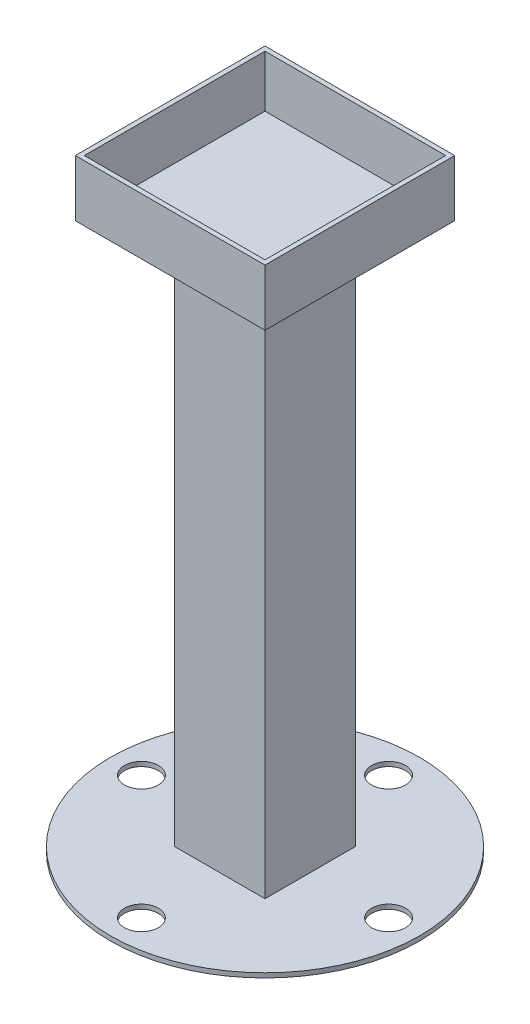
ISO-10303-21;
HEADER;
FILE_DESCRIPTION(('STEP AP214'),'2;1');
FILE_NAME('part.step','',(''),(''),'','','');
FILE_SCHEMA(('AUTOMOTIVE_DESIGN { 1 0 10303 214 1 1 1 1 }'));
ENDSEC;
DATA;
#1=APPLICATION_CONTEXT('core data for automotive mechanical design processes');
#2=APPLICATION_PROTOCOL_DEFINITION('international standard','automotive_design',2000,#1);
#3=PRODUCT_CONTEXT('',#1,'mechanical');
#4=PRODUCT('Part','Part','',(#3));
#5=PRODUCT_RELATED_PRODUCT_CATEGORY('part','',(#4));
#6=PRODUCT_DEFINITION_FORMATION('','',#4);
#7=PRODUCT_DEFINITION_CONTEXT('part definition',#1,'design');
#8=PRODUCT_DEFINITION('design','',#6,#7);
#9=PRODUCT_DEFINITION_SHAPE('','',#8);
#10=(LENGTH_UNIT() NAMED_UNIT(*) SI_UNIT(.MILLI.,.METRE.));
#11=(NAMED_UNIT(*) PLANE_ANGLE_UNIT() SI_UNIT($,.RADIAN.));
#12=(NAMED_UNIT(*) SI_UNIT($,.STERADIAN.) SOLID_ANGLE_UNIT());
#13=UNCERTAINTY_MEASURE_WITH_UNIT(LENGTH_MEASURE(1.E-05),#10,'distance_accuracy_value','');
#14=(GEOMETRIC_REPRESENTATION_CONTEXT(3) GLOBAL_UNCERTAINTY_ASSIGNED_CONTEXT((#13)) GLOBAL_UNIT_ASSIGNED_CONTEXT((#10,
#11,#12)) REPRESENTATION_CONTEXT('',''));
#15=CARTESIAN_POINT('',(0.,0.,0.));
#16=DIRECTION('',(0.,0.,1.));
#17=DIRECTION('',(1.,0.,0.));
#18=AXIS2_PLACEMENT_3D('',#15,#16,#17);
#19=CARTESIAN_POINT('',(0.,2.54,0.));
#20=DIRECTION('',(0.,-1.,0.));
#21=DIRECTION('',(0.,0.,-1.));
#22=AXIS2_PLACEMENT_3D('',#19,#20,#21);
#23=CYLINDRICAL_SURFACE('',#22,86.9315);
#24=CARTESIAN_POINT('',(0.,2.54,0.));
#25=DIRECTION('',(0.,1.,0.));
#26=DIRECTION('',(0.,0.,1.));
#27=AXIS2_PLACEMENT_3D('',#24,#25,#26);
#28=CIRCLE('',#27,86.9315);
#29=CARTESIAN_POINT('',(0.,2.54,86.9315));
#30=VERTEX_POINT('',#29);
#31=EDGE_CURVE('E11',#30,#30,#28,.T.);
#32=ORIENTED_EDGE('',*,*,#31,.F.);
#33=EDGE_LOOP('',(#32));
#34=FACE_BOUND('',#33,.T.);
#35=CARTESIAN_POINT('',(0.,0.,0.));
#36=DIRECTION('',(0.,1.,0.));
#37=DIRECTION('',(0.,0.,1.));
#38=AXIS2_PLACEMENT_3D('',#35,#36,#37);
#39=CIRCLE('',#38,86.9315);
#40=CARTESIAN_POINT('',(0.,0.,86.9315));
#41=VERTEX_POINT('',#40);
#42=EDGE_CURVE('E54',#41,#41,#39,.T.);
#43=ORIENTED_EDGE('',*,*,#42,.T.);
#44=EDGE_LOOP('',(#43));
#45=FACE_BOUND('',#44,.T.);
#46=ADVANCED_FACE('F45',(#34,#45),#23,.T.);
#47=CARTESIAN_POINT('',(0.,2.54,0.));
#48=DIRECTION('',(0.,1.,0.));
#49=DIRECTION('',(0.,0.,1.));
#50=AXIS2_PLACEMENT_3D('',#47,#48,#49);
#51=PLANE('',#50);
#52=CARTESIAN_POINT('',(0.,2.54,-69.50075));
#53=DIRECTION('',(0.,1.,0.));
#54=DIRECTION('',(0.,0.,1.));
#55=AXIS2_PLACEMENT_3D('',#52,#53,#54);
#56=CIRCLE('',#55,9.525);
#57=CARTESIAN_POINT('',(0.,2.54,-59.97575));
#58=VERTEX_POINT('',#57);
#59=EDGE_CURVE('E284',#58,#58,#56,.T.);
#60=ORIENTED_EDGE('',*,*,#59,.F.);
#61=EDGE_LOOP('',(#60));
#62=FACE_BOUND('',#61,.T.);
#63=CARTESIAN_POINT('',(69.50075,2.54,0.));
#64=DIRECTION('',(0.,1.,0.));
#65=DIRECTION('',(0.,0.,1.));
#66=AXIS2_PLACEMENT_3D('',#63,#64,#65);
#67=CIRCLE('',#66,9.52500000000002);
#68=CARTESIAN_POINT('',(69.50075,2.54,9.52500000000002));
#69=VERTEX_POINT('',#68);
#70=EDGE_CURVE('E399',#69,#69,#67,.T.);
#71=ORIENTED_EDGE('',*,*,#70,.F.);
#72=EDGE_LOOP('',(#71));
#73=FACE_BOUND('',#72,.T.);
#74=CARTESIAN_POINT('',(0.,2.54,69.50075));
#75=DIRECTION('',(0.,1.,0.));
#76=DIRECTION('',(0.,0.,1.));
#77=AXIS2_PLACEMENT_3D('',#74,#75,#76);
#78=CIRCLE('',#77,9.52499999999999);
#79=CARTESIAN_POINT('',(0.,2.54,79.02575));
#80=VERTEX_POINT('',#79);
#81=EDGE_CURVE('E391',#80,#80,#78,.T.);
#82=ORIENTED_EDGE('',*,*,#81,.F.);
#83=EDGE_LOOP('',(#82));
#84=FACE_BOUND('',#83,.T.);
#85=CARTESIAN_POINT('',(-69.50075,2.54,0.));
#86=DIRECTION('',(0.,1.,0.));
#87=DIRECTION('',(0.,0.,1.));
#88=AXIS2_PLACEMENT_3D('',#85,#86,#87);
#89=CIRCLE('',#88,9.52500000000001);
#90=CARTESIAN_POINT('',(-69.50075,2.54,9.52500000000001));
#91=VERTEX_POINT('',#90);
#92=EDGE_CURVE('E166',#91,#91,#89,.T.);
#93=ORIENTED_EDGE('',*,*,#92,.F.);
#94=EDGE_LOOP('',(#93));
#95=FACE_BOUND('',#94,.T.);
#96=DIRECTION('',(0.,0.,-1.));
#97=VECTOR('',#96,1.);
#98=CARTESIAN_POINT('',(25.4,2.54,-25.4));
#99=LINE('',#98,#97);
#100=CARTESIAN_POINT('',(25.4,2.54,25.4));
#101=VERTEX_POINT('',#100);
#102=CARTESIAN_POINT('',(25.4,2.54,-25.4));
#103=VERTEX_POINT('',#102);
#104=EDGE_CURVE('E70',#101,#103,#99,.T.);
#105=ORIENTED_EDGE('',*,*,#104,.F.);
#106=DIRECTION('',(1.,0.,0.));
#107=VECTOR('',#106,1.);
#108=CARTESIAN_POINT('',(-25.4,2.54,25.4));
#109=LINE('',#108,#107);
#110=CARTESIAN_POINT('',(-25.4,2.54,25.4));
#111=VERTEX_POINT('',#110);
#112=EDGE_CURVE('E236',#111,#101,#109,.T.);
#113=ORIENTED_EDGE('',*,*,#112,.F.);
#114=DIRECTION('',(0.,0.,1.));
#115=VECTOR('',#114,1.);
#116=CARTESIAN_POINT('',(-25.4,2.54,-25.4));
#117=LINE('',#116,#115);
#118=CARTESIAN_POINT('',(-25.4,2.54,-25.4));
#119=VERTEX_POINT('',#118);
#120=EDGE_CURVE('E255',#119,#111,#117,.T.);
#121=ORIENTED_EDGE('',*,*,#120,.F.);
#122=DIRECTION('',(-1.,0.,0.));
#123=VECTOR('',#122,1.);
#124=CARTESIAN_POINT('',(-25.4,2.54,-25.4));
#125=LINE('',#124,#123);
#126=EDGE_CURVE('E251',#103,#119,#125,.T.);
#127=ORIENTED_EDGE('',*,*,#126,.F.);
#128=EDGE_LOOP('',(#105,#113,#121,#127));
#129=FACE_BOUND('',#128,.T.);
#130=ORIENTED_EDGE('',*,*,#31,.T.);
#131=EDGE_LOOP('',(#130));
#132=FACE_BOUND('',#131,.T.);
#133=ADVANCED_FACE('F311',(#62,#73,#84,#95,#129,#132),#51,.T.);
#134=CARTESIAN_POINT('',(0.,0.,0.));
#135=DIRECTION('',(0.,1.,0.));
#136=DIRECTION('',(0.,0.,1.));
#137=AXIS2_PLACEMENT_3D('',#134,#135,#136);
#138=PLANE('',#137);
#139=CARTESIAN_POINT('',(0.,0.,-69.50075));
#140=DIRECTION('',(0.,1.,0.));
#141=DIRECTION('',(0.,0.,1.));
#142=AXIS2_PLACEMENT_3D('',#139,#140,#141);
#143=CIRCLE('',#142,9.525);
#144=CARTESIAN_POINT('',(0.,0.,-59.97575));
#145=VERTEX_POINT('',#144);
#146=EDGE_CURVE('E48',#145,#145,#143,.T.);
#147=ORIENTED_EDGE('',*,*,#146,.T.);
#148=EDGE_LOOP('',(#147));
#149=FACE_BOUND('',#148,.T.);
#150=CARTESIAN_POINT('',(69.50075,0.,0.));
#151=DIRECTION('',(0.,1.,0.));
#152=DIRECTION('',(0.,0.,1.));
#153=AXIS2_PLACEMENT_3D('',#150,#151,#152);
#154=CIRCLE('',#153,9.52500000000002);
#155=CARTESIAN_POINT('',(69.50075,0.,9.52500000000002));
#156=VERTEX_POINT('',#155);
#157=EDGE_CURVE('E287',#156,#156,#154,.T.);
#158=ORIENTED_EDGE('',*,*,#157,.T.);
#159=EDGE_LOOP('',(#158));
#160=FACE_BOUND('',#159,.T.);
#161=CARTESIAN_POINT('',(0.,0.,69.50075));
#162=DIRECTION('',(0.,1.,0.));
#163=DIRECTION('',(0.,0.,1.));
#164=AXIS2_PLACEMENT_3D('',#161,#162,#163);
#165=CIRCLE('',#164,9.52499999999999);
#166=CARTESIAN_POINT('',(0.,0.,79.02575));
#167=VERTEX_POINT('',#166);
#168=EDGE_CURVE('E283',#167,#167,#165,.T.);
#169=ORIENTED_EDGE('',*,*,#168,.T.);
#170=EDGE_LOOP('',(#169));
#171=FACE_BOUND('',#170,.T.);
#172=CARTESIAN_POINT('',(-69.50075,0.,0.));
#173=DIRECTION('',(0.,1.,0.));
#174=DIRECTION('',(0.,0.,1.));
#175=AXIS2_PLACEMENT_3D('',#172,#173,#174);
#176=CIRCLE('',#175,9.52500000000001);
#177=CARTESIAN_POINT('',(-69.50075,0.,9.52500000000001));
#178=VERTEX_POINT('',#177);
#179=EDGE_CURVE('E279',#178,#178,#176,.T.);
#180=ORIENTED_EDGE('',*,*,#179,.T.);
#181=EDGE_LOOP('',(#180));
#182=FACE_BOUND('',#181,.T.);
#183=ORIENTED_EDGE('',*,*,#42,.F.);
#184=EDGE_LOOP('',(#183));
#185=FACE_BOUND('',#184,.T.);
#186=ADVANCED_FACE('F296',(#149,#160,#171,#182,#185),#138,.F.);
#187=CARTESIAN_POINT('',(25.4,307.34,-25.4));
#188=DIRECTION('',(-1.,0.,0.));
#189=DIRECTION('',(0.,0.,1.));
#190=AXIS2_PLACEMENT_3D('',#187,#188,#189);
#191=PLANE('',#190);
#192=ORIENTED_EDGE('',*,*,#104,.T.);
#193=DIRECTION('',(0.,-1.,0.));
#194=VECTOR('',#193,1.);
#195=CARTESIAN_POINT('',(25.4,307.34,-25.4));
#196=LINE('',#195,#194);
#197=CARTESIAN_POINT('',(25.4,307.34,-25.4));
#198=VERTEX_POINT('',#197);
#199=EDGE_CURVE('E272',#198,#103,#196,.T.);
#200=ORIENTED_EDGE('',*,*,#199,.F.);
#201=DIRECTION('',(0.,0.,-1.));
#202=VECTOR('',#201,1.);
#203=CARTESIAN_POINT('',(25.4,307.34,-25.4));
#204=LINE('',#203,#202);
#205=CARTESIAN_POINT('',(25.4,307.34,25.4));
#206=VERTEX_POINT('',#205);
#207=EDGE_CURVE('E231',#206,#198,#204,.T.);
#208=ORIENTED_EDGE('',*,*,#207,.F.);
#209=DIRECTION('',(0.,-1.,0.));
#210=VECTOR('',#209,1.);
#211=CARTESIAN_POINT('',(25.4,307.34,25.4));
#212=LINE('',#211,#210);
#213=EDGE_CURVE('E248',#206,#101,#212,.T.);
#214=ORIENTED_EDGE('',*,*,#213,.T.);
#215=EDGE_LOOP('',(#192,#200,#208,#214));
#216=FACE_BOUND('',#215,.T.);
#217=ADVANCED_FACE('F324',(#216),#191,.F.);
#218=CARTESIAN_POINT('',(-25.4,307.34,-25.4));
#219=DIRECTION('',(0.,0.,1.));
#220=DIRECTION('',(1.,0.,0.));
#221=AXIS2_PLACEMENT_3D('',#218,#219,#220);
#222=PLANE('',#221);
#223=ORIENTED_EDGE('',*,*,#126,.T.);
#224=DIRECTION('',(0.,-1.,0.));
#225=VECTOR('',#224,1.);
#226=CARTESIAN_POINT('',(-25.4,307.34,-25.4));
#227=LINE('',#226,#225);
#228=CARTESIAN_POINT('',(-25.4,307.34,-25.4));
#229=VERTEX_POINT('',#228);
#230=EDGE_CURVE('E268',#229,#119,#227,.T.);
#231=ORIENTED_EDGE('',*,*,#230,.F.);
#232=DIRECTION('',(-1.,0.,0.));
#233=VECTOR('',#232,1.);
#234=CARTESIAN_POINT('',(-25.4,307.34,-25.4));
#235=LINE('',#234,#233);
#236=EDGE_CURVE('E235',#198,#229,#235,.T.);
#237=ORIENTED_EDGE('',*,*,#236,.F.);
#238=ORIENTED_EDGE('',*,*,#199,.T.);
#239=EDGE_LOOP('',(#223,#231,#237,#238));
#240=FACE_BOUND('',#239,.T.);
#241=ADVANCED_FACE('F328',(#240),#222,.F.);
#242=CARTESIAN_POINT('',(-25.4,307.34,-25.4));
#243=DIRECTION('',(1.,0.,0.));
#244=DIRECTION('',(0.,0.,-1.));
#245=AXIS2_PLACEMENT_3D('',#242,#243,#244);
#246=PLANE('',#245);
#247=ORIENTED_EDGE('',*,*,#120,.T.);
#248=DIRECTION('',(0.,-1.,0.));
#249=VECTOR('',#248,1.);
#250=CARTESIAN_POINT('',(-25.4,307.34,25.4));
#251=LINE('',#250,#249);
#252=CARTESIAN_POINT('',(-25.4,307.34,25.4));
#253=VERTEX_POINT('',#252);
#254=EDGE_CURVE('E264',#253,#111,#251,.T.);
#255=ORIENTED_EDGE('',*,*,#254,.F.);
#256=DIRECTION('',(0.,0.,1.));
#257=VECTOR('',#256,1.);
#258=CARTESIAN_POINT('',(-25.4,307.34,-25.4));
#259=LINE('',#258,#257);
#260=EDGE_CURVE('E240',#229,#253,#259,.T.);
#261=ORIENTED_EDGE('',*,*,#260,.F.);
#262=ORIENTED_EDGE('',*,*,#230,.T.);
#263=EDGE_LOOP('',(#247,#255,#261,#262));
#264=FACE_BOUND('',#263,.T.);
#265=ADVANCED_FACE('F334',(#264),#246,.F.);
#266=CARTESIAN_POINT('',(-25.4,307.34,25.4));
#267=DIRECTION('',(0.,0.,-1.));
#268=DIRECTION('',(-1.,0.,0.));
#269=AXIS2_PLACEMENT_3D('',#266,#267,#268);
#270=PLANE('',#269);
#271=ORIENTED_EDGE('',*,*,#112,.T.);
#272=ORIENTED_EDGE('',*,*,#213,.F.);
#273=DIRECTION('',(1.,0.,0.));
#274=VECTOR('',#273,1.);
#275=CARTESIAN_POINT('',(-25.4,307.34,25.4));
#276=LINE('',#275,#274);
#277=EDGE_CURVE('E244',#253,#206,#276,.T.);
#278=ORIENTED_EDGE('',*,*,#277,.F.);
#279=ORIENTED_EDGE('',*,*,#254,.T.);
#280=EDGE_LOOP('',(#271,#272,#278,#279));
#281=FACE_BOUND('',#280,.T.);
#282=ADVANCED_FACE('F338',(#281),#270,.F.);
#283=CARTESIAN_POINT('',(-53.34,339.09,-53.34));
#284=DIRECTION('',(0.,0.,1.));
#285=DIRECTION('',(1.,0.,0.));
#286=AXIS2_PLACEMENT_3D('',#283,#284,#285);
#287=PLANE('',#286);
#288=DIRECTION('',(-1.,0.,0.));
#289=VECTOR('',#288,1.);
#290=CARTESIAN_POINT('',(-53.34,307.34,-53.34));
#291=LINE('',#290,#289);
#292=CARTESIAN_POINT('',(53.34,307.34,-53.34));
#293=VERTEX_POINT('',#292);
#294=CARTESIAN_POINT('',(-53.34,307.34,-53.34));
#295=VERTEX_POINT('',#294);
#296=EDGE_CURVE('E184',#293,#295,#291,.T.);
#297=ORIENTED_EDGE('',*,*,#296,.T.);
#298=DIRECTION('',(0.,-1.,0.));
#299=VECTOR('',#298,1.);
#300=CARTESIAN_POINT('',(-53.34,339.09,-53.34));
#301=LINE('',#300,#299);
#302=CARTESIAN_POINT('',(-53.34,339.09,-53.34));
#303=VERTEX_POINT('',#302);
#304=EDGE_CURVE('E227',#303,#295,#301,.T.);
#305=ORIENTED_EDGE('',*,*,#304,.F.);
#306=DIRECTION('',(-1.,0.,0.));
#307=VECTOR('',#306,1.);
#308=CARTESIAN_POINT('',(-53.34,339.09,-53.34));
#309=LINE('',#308,#307);
#310=CARTESIAN_POINT('',(53.34,339.09,-53.34));
#311=VERTEX_POINT('',#310);
#312=EDGE_CURVE('E190',#311,#303,#309,.T.);
#313=ORIENTED_EDGE('',*,*,#312,.F.);
#314=DIRECTION('',(0.,-1.,0.));
#315=VECTOR('',#314,1.);
#316=CARTESIAN_POINT('',(53.34,339.09,-53.34));
#317=LINE('',#316,#315);
#318=EDGE_CURVE('E204',#311,#293,#317,.T.);
#319=ORIENTED_EDGE('',*,*,#318,.T.);
#320=EDGE_LOOP('',(#297,#305,#313,#319));
#321=FACE_BOUND('',#320,.T.);
#322=ADVANCED_FACE('F342',(#321),#287,.F.);
#323=CARTESIAN_POINT('',(-53.34,339.09,-53.34));
#324=DIRECTION('',(1.,0.,0.));
#325=DIRECTION('',(0.,0.,-1.));
#326=AXIS2_PLACEMENT_3D('',#323,#324,#325);
#327=PLANE('',#326);
#328=DIRECTION('',(0.,0.,1.));
#329=VECTOR('',#328,1.);
#330=CARTESIAN_POINT('',(-53.34,307.34,-53.34));
#331=LINE('',#330,#329);
#332=CARTESIAN_POINT('',(-53.34,307.34,53.34));
#333=VERTEX_POINT('',#332);
#334=EDGE_CURVE('E208',#295,#333,#331,.T.);
#335=ORIENTED_EDGE('',*,*,#334,.T.);
#336=DIRECTION('',(0.,-1.,0.));
#337=VECTOR('',#336,1.);
#338=CARTESIAN_POINT('',(-53.34,339.09,53.34));
#339=LINE('',#338,#337);
#340=CARTESIAN_POINT('',(-53.34,339.09,53.34));
#341=VERTEX_POINT('',#340);
#342=EDGE_CURVE('E223',#341,#333,#339,.T.);
#343=ORIENTED_EDGE('',*,*,#342,.F.);
#344=DIRECTION('',(0.,0.,1.));
#345=VECTOR('',#344,1.);
#346=CARTESIAN_POINT('',(-53.34,339.09,-53.34));
#347=LINE('',#346,#345);
#348=EDGE_CURVE('E194',#303,#341,#347,.T.);
#349=ORIENTED_EDGE('',*,*,#348,.F.);
#350=ORIENTED_EDGE('',*,*,#304,.T.);
#351=EDGE_LOOP('',(#335,#343,#349,#350));
#352=FACE_BOUND('',#351,.T.);
#353=ADVANCED_FACE('F346',(#352),#327,.F.);
#354=CARTESIAN_POINT('',(-53.34,339.09,53.34));
#355=DIRECTION('',(0.,0.,-1.));
#356=DIRECTION('',(-1.,0.,0.));
#357=AXIS2_PLACEMENT_3D('',#354,#355,#356);
#358=PLANE('',#357);
#359=DIRECTION('',(1.,0.,0.));
#360=VECTOR('',#359,1.);
#361=CARTESIAN_POINT('',(-53.34,307.34,53.34));
#362=LINE('',#361,#360);
#363=CARTESIAN_POINT('',(53.34,307.34,53.34));
#364=VERTEX_POINT('',#363);
#365=EDGE_CURVE('E211',#333,#364,#362,.T.);
#366=ORIENTED_EDGE('',*,*,#365,.T.);
#367=DIRECTION('',(0.,-1.,0.));
#368=VECTOR('',#367,1.);
#369=CARTESIAN_POINT('',(53.34,339.09,53.34));
#370=LINE('',#369,#368);
#371=CARTESIAN_POINT('',(53.34,339.09,53.34));
#372=VERTEX_POINT('',#371);
#373=EDGE_CURVE('E219',#372,#364,#370,.T.);
#374=ORIENTED_EDGE('',*,*,#373,.F.);
#375=DIRECTION('',(1.,0.,0.));
#376=VECTOR('',#375,1.);
#377=CARTESIAN_POINT('',(-53.34,339.09,53.34));
#378=LINE('',#377,#376);
#379=EDGE_CURVE('E198',#341,#372,#378,.T.);
#380=ORIENTED_EDGE('',*,*,#379,.F.);
#381=ORIENTED_EDGE('',*,*,#342,.T.);
#382=EDGE_LOOP('',(#366,#374,#380,#381));
#383=FACE_BOUND('',#382,.T.);
#384=ADVANCED_FACE('F350',(#383),#358,.F.);
#385=CARTESIAN_POINT('',(53.34,339.09,-53.34));
#386=DIRECTION('',(-1.,0.,0.));
#387=DIRECTION('',(0.,0.,1.));
#388=AXIS2_PLACEMENT_3D('',#385,#386,#387);
#389=PLANE('',#388);
#390=DIRECTION('',(0.,0.,-1.));
#391=VECTOR('',#390,1.);
#392=CARTESIAN_POINT('',(53.34,307.34,-53.34));
#393=LINE('',#392,#391);
#394=EDGE_CURVE('E195',#364,#293,#393,.T.);
#395=ORIENTED_EDGE('',*,*,#394,.T.);
#396=ORIENTED_EDGE('',*,*,#318,.F.);
#397=DIRECTION('',(0.,0.,-1.));
#398=VECTOR('',#397,1.);
#399=CARTESIAN_POINT('',(53.34,339.09,-53.34));
#400=LINE('',#399,#398);
#401=EDGE_CURVE('E201',#372,#311,#400,.T.);
#402=ORIENTED_EDGE('',*,*,#401,.F.);
#403=ORIENTED_EDGE('',*,*,#373,.T.);
#404=EDGE_LOOP('',(#395,#396,#402,#403));
#405=FACE_BOUND('',#404,.T.);
#406=ADVANCED_FACE('F354',(#405),#389,.F.);
#407=CARTESIAN_POINT('',(0.,339.09,0.));
#408=DIRECTION('',(0.,-1.,0.));
#409=DIRECTION('',(0.,0.,-1.));
#410=AXIS2_PLACEMENT_3D('',#407,#408,#409);
#411=PLANE('',#410);
#412=DIRECTION('',(-1.,0.,0.));
#413=VECTOR('',#412,1.);
#414=CARTESIAN_POINT('',(-50.8,339.09,-50.8));
#415=LINE('',#414,#413);
#416=CARTESIAN_POINT('',(50.8,339.09,-50.8));
#417=VERTEX_POINT('',#416);
#418=CARTESIAN_POINT('',(-50.8,339.09,-50.8));
#419=VERTEX_POINT('',#418);
#420=EDGE_CURVE('E175',#417,#419,#415,.T.);
#421=ORIENTED_EDGE('',*,*,#420,.F.);
#422=DIRECTION('',(0.,0.,-1.));
#423=VECTOR('',#422,1.);
#424=CARTESIAN_POINT('',(50.8,339.09,-50.8));
#425=LINE('',#424,#423);
#426=CARTESIAN_POINT('',(50.8,339.09,50.8));
#427=VERTEX_POINT('',#426);
#428=EDGE_CURVE('E62',#427,#417,#425,.T.);
#429=ORIENTED_EDGE('',*,*,#428,.F.);
#430=DIRECTION('',(1.,0.,0.));
#431=VECTOR('',#430,1.);
#432=CARTESIAN_POINT('',(-50.8,339.09,50.8));
#433=LINE('',#432,#431);
#434=CARTESIAN_POINT('',(-50.8,339.09,50.8));
#435=VERTEX_POINT('',#434);
#436=EDGE_CURVE('E159',#435,#427,#433,.T.);
#437=ORIENTED_EDGE('',*,*,#436,.F.);
#438=DIRECTION('',(0.,0.,1.));
#439=VECTOR('',#438,1.);
#440=CARTESIAN_POINT('',(-50.8,339.09,-50.8));
#441=LINE('',#440,#439);
#442=EDGE_CURVE('E163',#419,#435,#441,.T.);
#443=ORIENTED_EDGE('',*,*,#442,.F.);
#444=EDGE_LOOP('',(#421,#429,#437,#443));
#445=FACE_BOUND('',#444,.T.);
#446=ORIENTED_EDGE('',*,*,#312,.T.);
#447=ORIENTED_EDGE('',*,*,#348,.T.);
#448=ORIENTED_EDGE('',*,*,#379,.T.);
#449=ORIENTED_EDGE('',*,*,#401,.T.);
#450=EDGE_LOOP('',(#446,#447,#448,#449));
#451=FACE_BOUND('',#450,.T.);
#452=ADVANCED_FACE('F358',(#445,#451),#411,.F.);
#453=CARTESIAN_POINT('',(0.,307.34,0.));
#454=DIRECTION('',(0.,-1.,0.));
#455=DIRECTION('',(0.,0.,-1.));
#456=AXIS2_PLACEMENT_3D('',#453,#454,#455);
#457=PLANE('',#456);
#458=ORIENTED_EDGE('',*,*,#277,.T.);
#459=ORIENTED_EDGE('',*,*,#207,.T.);
#460=ORIENTED_EDGE('',*,*,#236,.T.);
#461=ORIENTED_EDGE('',*,*,#260,.T.);
#462=EDGE_LOOP('',(#458,#459,#460,#461));
#463=FACE_BOUND('',#462,.T.);
#464=ORIENTED_EDGE('',*,*,#296,.F.);
#465=ORIENTED_EDGE('',*,*,#394,.F.);
#466=ORIENTED_EDGE('',*,*,#365,.F.);
#467=ORIENTED_EDGE('',*,*,#334,.F.);
#468=EDGE_LOOP('',(#464,#465,#466,#467));
#469=FACE_BOUND('',#468,.T.);
#470=ADVANCED_FACE('F360',(#463,#469),#457,.T.);
#471=CARTESIAN_POINT('',(50.8,309.88,-50.8));
#472=DIRECTION('',(1.,0.,0.));
#473=DIRECTION('',(0.,0.,-1.));
#474=AXIS2_PLACEMENT_3D('',#471,#472,#473);
#475=PLANE('',#474);
#476=ORIENTED_EDGE('',*,*,#428,.T.);
#477=DIRECTION('',(0.,1.,0.));
#478=VECTOR('',#477,1.);
#479=CARTESIAN_POINT('',(50.8,309.88,-50.8));
#480=LINE('',#479,#478);
#481=CARTESIAN_POINT('',(50.8,309.88,-50.8));
#482=VERTEX_POINT('',#481);
#483=EDGE_CURVE('E134',#482,#417,#480,.T.);
#484=ORIENTED_EDGE('',*,*,#483,.F.);
#485=DIRECTION('',(0.,0.,-1.));
#486=VECTOR('',#485,1.);
#487=CARTESIAN_POINT('',(50.8,309.88,-50.8));
#488=LINE('',#487,#486);
#489=CARTESIAN_POINT('',(50.8,309.88,50.8));
#490=VERTEX_POINT('',#489);
#491=EDGE_CURVE('E138',#490,#482,#488,.T.);
#492=ORIENTED_EDGE('',*,*,#491,.F.);
#493=DIRECTION('',(0.,1.,0.));
#494=VECTOR('',#493,1.);
#495=CARTESIAN_POINT('',(50.8,309.88,50.8));
#496=LINE('',#495,#494);
#497=EDGE_CURVE('E181',#490,#427,#496,.T.);
#498=ORIENTED_EDGE('',*,*,#497,.T.);
#499=EDGE_LOOP('',(#476,#484,#492,#498));
#500=FACE_BOUND('',#499,.T.);
#501=ADVANCED_FACE('F136',(#500),#475,.F.);
#502=CARTESIAN_POINT('',(-50.8,309.88,50.8));
#503=DIRECTION('',(0.,0.,1.));
#504=DIRECTION('',(1.,0.,0.));
#505=AXIS2_PLACEMENT_3D('',#502,#503,#504);
#506=PLANE('',#505);
#507=ORIENTED_EDGE('',*,*,#436,.T.);
#508=ORIENTED_EDGE('',*,*,#497,.F.);
#509=DIRECTION('',(1.,0.,0.));
#510=VECTOR('',#509,1.);
#511=CARTESIAN_POINT('',(-50.8,309.88,50.8));
#512=LINE('',#511,#510);
#513=CARTESIAN_POINT('',(-50.8,309.88,50.8));
#514=VERTEX_POINT('',#513);
#515=EDGE_CURVE('E145',#514,#490,#512,.T.);
#516=ORIENTED_EDGE('',*,*,#515,.F.);
#517=DIRECTION('',(0.,1.,0.));
#518=VECTOR('',#517,1.);
#519=CARTESIAN_POINT('',(-50.8,309.88,50.8));
#520=LINE('',#519,#518);
#521=EDGE_CURVE('E185',#514,#435,#520,.T.);
#522=ORIENTED_EDGE('',*,*,#521,.T.);
#523=EDGE_LOOP('',(#507,#508,#516,#522));
#524=FACE_BOUND('',#523,.T.);
#525=ADVANCED_FACE('F369',(#524),#506,.F.);
#526=CARTESIAN_POINT('',(-50.8,309.88,-50.8));
#527=DIRECTION('',(-1.,0.,0.));
#528=DIRECTION('',(0.,0.,1.));
#529=AXIS2_PLACEMENT_3D('',#526,#527,#528);
#530=PLANE('',#529);
#531=ORIENTED_EDGE('',*,*,#442,.T.);
#532=ORIENTED_EDGE('',*,*,#521,.F.);
#533=DIRECTION('',(0.,0.,1.));
#534=VECTOR('',#533,1.);
#535=CARTESIAN_POINT('',(-50.8,309.88,-50.8));
#536=LINE('',#535,#534);
#537=CARTESIAN_POINT('',(-50.8,309.88,-50.8));
#538=VERTEX_POINT('',#537);
#539=EDGE_CURVE('E154',#538,#514,#536,.T.);
#540=ORIENTED_EDGE('',*,*,#539,.F.);
#541=DIRECTION('',(0.,1.,0.));
#542=VECTOR('',#541,1.);
#543=CARTESIAN_POINT('',(-50.8,309.88,-50.8));
#544=LINE('',#543,#542);
#545=EDGE_CURVE('E144',#538,#419,#544,.T.);
#546=ORIENTED_EDGE('',*,*,#545,.T.);
#547=EDGE_LOOP('',(#531,#532,#540,#546));
#548=FACE_BOUND('',#547,.T.);
#549=ADVANCED_FACE('F372',(#548),#530,.F.);
#550=CARTESIAN_POINT('',(-50.8,309.88,-50.8));
#551=DIRECTION('',(0.,0.,-1.));
#552=DIRECTION('',(-1.,0.,0.));
#553=AXIS2_PLACEMENT_3D('',#550,#551,#552);
#554=PLANE('',#553);
#555=ORIENTED_EDGE('',*,*,#420,.T.);
#556=ORIENTED_EDGE('',*,*,#545,.F.);
#557=DIRECTION('',(-1.,0.,0.));
#558=VECTOR('',#557,1.);
#559=CARTESIAN_POINT('',(-50.8,309.88,-50.8));
#560=LINE('',#559,#558);
#561=EDGE_CURVE('E148',#482,#538,#560,.T.);
#562=ORIENTED_EDGE('',*,*,#561,.F.);
#563=ORIENTED_EDGE('',*,*,#483,.T.);
#564=EDGE_LOOP('',(#555,#556,#562,#563));
#565=FACE_BOUND('',#564,.T.);
#566=ADVANCED_FACE('F149',(#565),#554,.F.);
#567=CARTESIAN_POINT('',(0.,309.88,0.));
#568=DIRECTION('',(0.,1.,0.));
#569=DIRECTION('',(0.,0.,1.));
#570=AXIS2_PLACEMENT_3D('',#567,#568,#569);
#571=PLANE('',#570);
#572=ORIENTED_EDGE('',*,*,#491,.T.);
#573=ORIENTED_EDGE('',*,*,#561,.T.);
#574=ORIENTED_EDGE('',*,*,#539,.T.);
#575=ORIENTED_EDGE('',*,*,#515,.T.);
#576=EDGE_LOOP('',(#572,#573,#574,#575));
#577=FACE_BOUND('',#576,.T.);
#578=ADVANCED_FACE('F156',(#577),#571,.T.);
#579=CARTESIAN_POINT('',(-69.50075,-26.67,0.));
#580=DIRECTION('',(0.,1.,0.));
#581=DIRECTION('',(0.,0.,1.));
#582=AXIS2_PLACEMENT_3D('',#579,#580,#581);
#583=CYLINDRICAL_SURFACE('',#582,9.52500000000001);
#584=CARTESIAN_POINT('',(-69.50075,2.54,9.52500000000001));
#585=CARTESIAN_POINT('',(-69.50075,2.51354166666667,9.52500000000001));
#586=CARTESIAN_POINT('',(-69.50075,2.48708333333333,9.52500000000001));
#587=CARTESIAN_POINT('',(-69.50075,2.43416666666667,9.52500000000001));
#588=CARTESIAN_POINT('',(-69.50075,2.40770833333333,9.52500000000001));
#589=CARTESIAN_POINT('',(-69.50075,2.35479166666667,9.52500000000001));
#590=CARTESIAN_POINT('',(-69.50075,2.32833333333333,9.52500000000001));
#591=CARTESIAN_POINT('',(-69.50075,2.27541666666667,9.52500000000001));
#592=CARTESIAN_POINT('',(-69.50075,2.24895833333334,9.52500000000001));
#593=CARTESIAN_POINT('',(-69.50075,2.19604166666667,9.52500000000001));
#594=CARTESIAN_POINT('',(-69.50075,2.16958333333333,9.52500000000001));
#595=CARTESIAN_POINT('',(-69.50075,2.11666666666667,9.52500000000001));
#596=CARTESIAN_POINT('',(-69.50075,2.09020833333333,9.52500000000001));
#597=CARTESIAN_POINT('',(-69.50075,2.03729166666667,9.52500000000001));
#598=CARTESIAN_POINT('',(-69.50075,2.01083333333333,9.52500000000001));
#599=CARTESIAN_POINT('',(-69.50075,1.95791666666667,9.52500000000001));
#600=CARTESIAN_POINT('',(-69.50075,1.93145833333333,9.52500000000001));
#601=CARTESIAN_POINT('',(-69.50075,1.87854166666667,9.52500000000001));
#602=CARTESIAN_POINT('',(-69.50075,1.85208333333333,9.52500000000001));
#603=CARTESIAN_POINT('',(-69.50075,1.79916666666667,9.52500000000001));
#604=CARTESIAN_POINT('',(-69.50075,1.77270833333333,9.52500000000001));
#605=CARTESIAN_POINT('',(-69.50075,1.71979166666667,9.52500000000001));
#606=CARTESIAN_POINT('',(-69.50075,1.69333333333333,9.52500000000001));
#607=CARTESIAN_POINT('',(-69.50075,1.64041666666667,9.52500000000001));
#608=CARTESIAN_POINT('',(-69.50075,1.61395833333333,9.52500000000001));
#609=CARTESIAN_POINT('',(-69.50075,1.56104166666667,9.52500000000001));
#610=CARTESIAN_POINT('',(-69.50075,1.53458333333333,9.52500000000001));
#611=CARTESIAN_POINT('',(-69.50075,1.48166666666667,9.52500000000001));
#612=CARTESIAN_POINT('',(-69.50075,1.45520833333333,9.52500000000001));
#613=CARTESIAN_POINT('',(-69.50075,1.40229166666667,9.52500000000001));
#614=CARTESIAN_POINT('',(-69.50075,1.37583333333333,9.52500000000001));
#615=CARTESIAN_POINT('',(-69.50075,1.32291666666667,9.52500000000001));
#616=CARTESIAN_POINT('',(-69.50075,1.29645833333333,9.52500000000001));
#617=CARTESIAN_POINT('',(-69.50075,1.24354166666667,9.52500000000001));
#618=CARTESIAN_POINT('',(-69.50075,1.21708333333333,9.52500000000001));
#619=CARTESIAN_POINT('',(-69.50075,1.16416666666667,9.52500000000001));
#620=CARTESIAN_POINT('',(-69.50075,1.13770833333333,9.52500000000001));
#621=CARTESIAN_POINT('',(-69.50075,1.08479166666667,9.52500000000001));
#622=CARTESIAN_POINT('',(-69.50075,1.05833333333333,9.52500000000001));
#623=CARTESIAN_POINT('',(-69.50075,1.00541666666667,9.52500000000001));
#624=CARTESIAN_POINT('',(-69.50075,0.978958333333335,9.52500000000001));
#625=CARTESIAN_POINT('',(-69.50075,0.926041666666668,9.52500000000001));
#626=CARTESIAN_POINT('',(-69.50075,0.899583333333333,9.52500000000001));
#627=CARTESIAN_POINT('',(-69.50075,0.846666666666666,9.52500000000001));
#628=CARTESIAN_POINT('',(-69.50075,0.820208333333333,9.52500000000001));
#629=CARTESIAN_POINT('',(-69.50075,0.767291666666666,9.52500000000001));
#630=CARTESIAN_POINT('',(-69.50075,0.740833333333333,9.52500000000001));
#631=CARTESIAN_POINT('',(-69.50075,0.687916666666667,9.52500000000001));
#632=CARTESIAN_POINT('',(-69.50075,0.661458333333333,9.52500000000001));
#633=CARTESIAN_POINT('',(-69.50075,0.608541666666667,9.52500000000001));
#634=CARTESIAN_POINT('',(-69.50075,0.582083333333334,9.52500000000001));
#635=CARTESIAN_POINT('',(-69.50075,0.529166666666667,9.52500000000001));
#636=CARTESIAN_POINT('',(-69.50075,0.502708333333334,9.52500000000001));
#637=CARTESIAN_POINT('',(-69.50075,0.449791666666668,9.52500000000001));
#638=CARTESIAN_POINT('',(-69.50075,0.423333333333335,9.52500000000001));
#639=CARTESIAN_POINT('',(-69.50075,0.370416666666667,9.52500000000001));
#640=CARTESIAN_POINT('',(-69.50075,0.343958333333333,9.52500000000001));
#641=CARTESIAN_POINT('',(-69.50075,0.291041666666665,9.52500000000001));
#642=CARTESIAN_POINT('',(-69.50075,0.264583333333332,9.52500000000001));
#643=CARTESIAN_POINT('',(-69.50075,0.211666666666666,9.52500000000001));
#644=CARTESIAN_POINT('',(-69.50075,0.185208333333332,9.52500000000001));
#645=CARTESIAN_POINT('',(-69.50075,0.132291666666666,9.52500000000001));
#646=CARTESIAN_POINT('',(-69.50075,0.105833333333333,9.52500000000001));
#647=CARTESIAN_POINT('',(-69.50075,0.0529166666666664,9.52500000000001));
#648=CARTESIAN_POINT('',(-69.50075,0.0264583333333332,9.52500000000001));
#649=CARTESIAN_POINT('',(-69.50075,0.,9.52500000000001));
#650=B_SPLINE_CURVE_WITH_KNOTS('',3,(#584,#585,#586,#587,#588,#589,#590,#591,#592,#593,#594,
#595,#596,#597,#598,#599,#600,#601,#602,#603,#604,#605,#606,#607,#608,#609,#610,#611,#612,#613,
#614,#615,#616,#617,#618,#619,#620,#621,#622,#623,#624,#625,#626,#627,#628,#629,#630,#631,#632,
#633,#634,#635,#636,#637,#638,#639,#640,#641,#642,#643,#644,#645,#646,#647,#648,#649),
.UNSPECIFIED.,.F.,.F.,(4,2,2,2,2,2,2,2,2,2,2,2,2,2,2,2,2,2,2,2,2,2,2,2,2,2,2,2,2,2,2,2,4),(0.,
0.0793749999999996,0.158749999999999,0.238124999999999,0.317499999999998,0.396875000000001,
0.476250000000001,0.555625000000001,0.635,0.714375,0.793749999999999,0.873124999999999,
0.952500000000002,1.031875,1.11125,1.190625,1.27,1.349375,1.42875,1.508125,1.5875,1.666875,
1.74625,1.825625,1.905,1.984375,2.06375,2.143125,2.2225,2.301875,2.38125,2.460625,2.54),.UNSPECIFIED.);
#651=EDGE_CURVE('BSEAM381',#91,#178,#650,.T.);
#652=ORIENTED_EDGE('',*,*,#92,.T.);
#653=ORIENTED_EDGE('',*,*,#179,.F.);
#654=ORIENTED_EDGE('',*,*,#651,.T.);
#655=ORIENTED_EDGE('',*,*,#651,.F.);
#656=EDGE_LOOP('',(#652,#654,#653,#655));
#657=FACE_BOUND('',#656,.T.);
#658=ADVANCED_FACE('F381',(#657),#583,.F.);
#659=CARTESIAN_POINT('',(0.,-26.67,69.50075));
#660=DIRECTION('',(0.,1.,0.));
#661=DIRECTION('',(0.,0.,1.));
#662=AXIS2_PLACEMENT_3D('',#659,#660,#661);
#663=CYLINDRICAL_SURFACE('',#662,9.52499999999999);
#664=CARTESIAN_POINT('',(0.,2.54,79.02575));
#665=CARTESIAN_POINT('',(0.,2.51354166666667,79.02575));
#666=CARTESIAN_POINT('',(0.,2.48708333333333,79.02575));
#667=CARTESIAN_POINT('',(0.,2.43416666666667,79.02575));
#668=CARTESIAN_POINT('',(0.,2.40770833333333,79.02575));
#669=CARTESIAN_POINT('',(0.,2.35479166666667,79.02575));
#670=CARTESIAN_POINT('',(0.,2.32833333333333,79.02575));
#671=CARTESIAN_POINT('',(0.,2.27541666666667,79.02575));
#672=CARTESIAN_POINT('',(0.,2.24895833333334,79.02575));
#673=CARTESIAN_POINT('',(0.,2.19604166666667,79.02575));
#674=CARTESIAN_POINT('',(0.,2.16958333333333,79.02575));
#675=CARTESIAN_POINT('',(0.,2.11666666666667,79.02575));
#676=CARTESIAN_POINT('',(0.,2.09020833333333,79.02575));
#677=CARTESIAN_POINT('',(0.,2.03729166666667,79.02575));
#678=CARTESIAN_POINT('',(0.,2.01083333333333,79.02575));
#679=CARTESIAN_POINT('',(0.,1.95791666666667,79.02575));
#680=CARTESIAN_POINT('',(0.,1.93145833333333,79.02575));
#681=CARTESIAN_POINT('',(0.,1.87854166666667,79.02575));
#682=CARTESIAN_POINT('',(0.,1.85208333333333,79.02575));
#683=CARTESIAN_POINT('',(0.,1.79916666666667,79.02575));
#684=CARTESIAN_POINT('',(0.,1.77270833333333,79.02575));
#685=CARTESIAN_POINT('',(0.,1.71979166666667,79.02575));
#686=CARTESIAN_POINT('',(0.,1.69333333333333,79.02575));
#687=CARTESIAN_POINT('',(0.,1.64041666666667,79.02575));
#688=CARTESIAN_POINT('',(0.,1.61395833333333,79.02575));
#689=CARTESIAN_POINT('',(0.,1.56104166666667,79.02575));
#690=CARTESIAN_POINT('',(0.,1.53458333333333,79.02575));
#691=CARTESIAN_POINT('',(0.,1.48166666666667,79.02575));
#692=CARTESIAN_POINT('',(0.,1.45520833333333,79.02575));
#693=CARTESIAN_POINT('',(0.,1.40229166666667,79.02575));
#694=CARTESIAN_POINT('',(0.,1.37583333333333,79.02575));
#695=CARTESIAN_POINT('',(0.,1.32291666666667,79.02575));
#696=CARTESIAN_POINT('',(0.,1.29645833333333,79.02575));
#697=CARTESIAN_POINT('',(0.,1.24354166666667,79.02575));
#698=CARTESIAN_POINT('',(0.,1.21708333333333,79.02575));
#699=CARTESIAN_POINT('',(0.,1.16416666666667,79.02575));
#700=CARTESIAN_POINT('',(0.,1.13770833333333,79.02575));
#701=CARTESIAN_POINT('',(0.,1.08479166666667,79.02575));
#702=CARTESIAN_POINT('',(0.,1.05833333333333,79.02575));
#703=CARTESIAN_POINT('',(0.,1.00541666666667,79.02575));
#704=CARTESIAN_POINT('',(0.,0.978958333333335,79.02575));
#705=CARTESIAN_POINT('',(0.,0.926041666666668,79.02575));
#706=CARTESIAN_POINT('',(0.,0.899583333333333,79.02575));
#707=CARTESIAN_POINT('',(0.,0.846666666666666,79.02575));
#708=CARTESIAN_POINT('',(0.,0.820208333333333,79.02575));
#709=CARTESIAN_POINT('',(0.,0.767291666666666,79.02575));
#710=CARTESIAN_POINT('',(0.,0.740833333333333,79.02575));
#711=CARTESIAN_POINT('',(0.,0.687916666666667,79.02575));
#712=CARTESIAN_POINT('',(0.,0.661458333333333,79.02575));
#713=CARTESIAN_POINT('',(0.,0.608541666666667,79.02575));
#714=CARTESIAN_POINT('',(0.,0.582083333333334,79.02575));
#715=CARTESIAN_POINT('',(0.,0.529166666666667,79.02575));
#716=CARTESIAN_POINT('',(0.,0.502708333333334,79.02575));
#717=CARTESIAN_POINT('',(0.,0.449791666666668,79.02575));
#718=CARTESIAN_POINT('',(0.,0.423333333333335,79.02575));
#719=CARTESIAN_POINT('',(0.,0.370416666666667,79.02575));
#720=CARTESIAN_POINT('',(0.,0.343958333333333,79.02575));
#721=CARTESIAN_POINT('',(0.,0.291041666666665,79.02575));
#722=CARTESIAN_POINT('',(0.,0.264583333333332,79.02575));
#723=CARTESIAN_POINT('',(0.,0.211666666666666,79.02575));
#724=CARTESIAN_POINT('',(0.,0.185208333333332,79.02575));
#725=CARTESIAN_POINT('',(0.,0.132291666666666,79.02575));
#726=CARTESIAN_POINT('',(0.,0.105833333333333,79.02575));
#727=CARTESIAN_POINT('',(0.,0.0529166666666664,79.02575));
#728=CARTESIAN_POINT('',(0.,0.0264583333333332,79.02575));
#729=CARTESIAN_POINT('',(0.,0.,79.02575));
#730=B_SPLINE_CURVE_WITH_KNOTS('',3,(#664,#665,#666,#667,#668,#669,#670,#671,#672,#673,#674,
#675,#676,#677,#678,#679,#680,#681,#682,#683,#684,#685,#686,#687,#688,#689,#690,#691,#692,#693,
#694,#695,#696,#697,#698,#699,#700,#701,#702,#703,#704,#705,#706,#707,#708,#709,#710,#711,#712,
#713,#714,#715,#716,#717,#718,#719,#720,#721,#722,#723,#724,#725,#726,#727,#728,#729),
.UNSPECIFIED.,.F.,.F.,(4,2,2,2,2,2,2,2,2,2,2,2,2,2,2,2,2,2,2,2,2,2,2,2,2,2,2,2,2,2,2,2,4),(0.,
0.0793749999999996,0.158749999999999,0.238124999999999,0.317499999999998,0.396875000000001,
0.476250000000001,0.555625000000001,0.635,0.714375,0.793749999999999,0.873124999999999,
0.952500000000002,1.031875,1.11125,1.190625,1.27,1.349375,1.42875,1.508125,1.5875,1.666875,
1.74625,1.825625,1.905,1.984375,2.06375,2.143125,2.2225,2.301875,2.38125,2.460625,2.54),.UNSPECIFIED.);
#731=EDGE_CURVE('BSEAM306',#80,#167,#730,.T.);
#732=ORIENTED_EDGE('',*,*,#81,.T.);
#733=ORIENTED_EDGE('',*,*,#168,.F.);
#734=ORIENTED_EDGE('',*,*,#731,.T.);
#735=ORIENTED_EDGE('',*,*,#731,.F.);
#736=EDGE_LOOP('',(#732,#734,#733,#735));
#737=FACE_BOUND('',#736,.T.);
#738=ADVANCED_FACE('F306',(#737),#663,.F.);
#739=CARTESIAN_POINT('',(69.50075,-26.67,0.));
#740=DIRECTION('',(0.,1.,0.));
#741=DIRECTION('',(0.,0.,1.));
#742=AXIS2_PLACEMENT_3D('',#739,#740,#741);
#743=CYLINDRICAL_SURFACE('',#742,9.52500000000002);
#744=CARTESIAN_POINT('',(69.50075,2.54,9.52500000000002));
#745=CARTESIAN_POINT('',(69.50075,2.51354166666667,9.52500000000002));
#746=CARTESIAN_POINT('',(69.50075,2.48708333333333,9.52500000000002));
#747=CARTESIAN_POINT('',(69.50075,2.43416666666667,9.52500000000002));
#748=CARTESIAN_POINT('',(69.50075,2.40770833333333,9.52500000000002));
#749=CARTESIAN_POINT('',(69.50075,2.35479166666667,9.52500000000002));
#750=CARTESIAN_POINT('',(69.50075,2.32833333333333,9.52500000000002));
#751=CARTESIAN_POINT('',(69.50075,2.27541666666667,9.52500000000002));
#752=CARTESIAN_POINT('',(69.50075,2.24895833333334,9.52500000000002));
#753=CARTESIAN_POINT('',(69.50075,2.19604166666667,9.52500000000002));
#754=CARTESIAN_POINT('',(69.50075,2.16958333333333,9.52500000000002));
#755=CARTESIAN_POINT('',(69.50075,2.11666666666667,9.52500000000002));
#756=CARTESIAN_POINT('',(69.50075,2.09020833333333,9.52500000000002));
#757=CARTESIAN_POINT('',(69.50075,2.03729166666667,9.52500000000002));
#758=CARTESIAN_POINT('',(69.50075,2.01083333333333,9.52500000000002));
#759=CARTESIAN_POINT('',(69.50075,1.95791666666667,9.52500000000002));
#760=CARTESIAN_POINT('',(69.50075,1.93145833333333,9.52500000000002));
#761=CARTESIAN_POINT('',(69.50075,1.87854166666667,9.52500000000002));
#762=CARTESIAN_POINT('',(69.50075,1.85208333333333,9.52500000000002));
#763=CARTESIAN_POINT('',(69.50075,1.79916666666667,9.52500000000002));
#764=CARTESIAN_POINT('',(69.50075,1.77270833333333,9.52500000000002));
#765=CARTESIAN_POINT('',(69.50075,1.71979166666667,9.52500000000002));
#766=CARTESIAN_POINT('',(69.50075,1.69333333333333,9.52500000000002));
#767=CARTESIAN_POINT('',(69.50075,1.64041666666667,9.52500000000002));
#768=CARTESIAN_POINT('',(69.50075,1.61395833333333,9.52500000000002));
#769=CARTESIAN_POINT('',(69.50075,1.56104166666667,9.52500000000002));
#770=CARTESIAN_POINT('',(69.50075,1.53458333333333,9.52500000000002));
#771=CARTESIAN_POINT('',(69.50075,1.48166666666667,9.52500000000002));
#772=CARTESIAN_POINT('',(69.50075,1.45520833333333,9.52500000000002));
#773=CARTESIAN_POINT('',(69.50075,1.40229166666667,9.52500000000002));
#774=CARTESIAN_POINT('',(69.50075,1.37583333333333,9.52500000000002));
#775=CARTESIAN_POINT('',(69.50075,1.32291666666667,9.52500000000002));
#776=CARTESIAN_POINT('',(69.50075,1.29645833333333,9.52500000000002));
#777=CARTESIAN_POINT('',(69.50075,1.24354166666667,9.52500000000002));
#778=CARTESIAN_POINT('',(69.50075,1.21708333333333,9.52500000000002));
#779=CARTESIAN_POINT('',(69.50075,1.16416666666667,9.52500000000002));
#780=CARTESIAN_POINT('',(69.50075,1.13770833333333,9.52500000000002));
#781=CARTESIAN_POINT('',(69.50075,1.08479166666667,9.52500000000002));
#782=CARTESIAN_POINT('',(69.50075,1.05833333333333,9.52500000000002));
#783=CARTESIAN_POINT('',(69.50075,1.00541666666667,9.52500000000002));
#784=CARTESIAN_POINT('',(69.50075,0.978958333333335,9.52500000000002));
#785=CARTESIAN_POINT('',(69.50075,0.926041666666668,9.52500000000002));
#786=CARTESIAN_POINT('',(69.50075,0.899583333333333,9.52500000000002));
#787=CARTESIAN_POINT('',(69.50075,0.846666666666666,9.52500000000002));
#788=CARTESIAN_POINT('',(69.50075,0.820208333333333,9.52500000000002));
#789=CARTESIAN_POINT('',(69.50075,0.767291666666666,9.52500000000002));
#790=CARTESIAN_POINT('',(69.50075,0.740833333333333,9.52500000000002));
#791=CARTESIAN_POINT('',(69.50075,0.687916666666667,9.52500000000002));
#792=CARTESIAN_POINT('',(69.50075,0.661458333333333,9.52500000000002));
#793=CARTESIAN_POINT('',(69.50075,0.608541666666667,9.52500000000002));
#794=CARTESIAN_POINT('',(69.50075,0.582083333333334,9.52500000000002));
#795=CARTESIAN_POINT('',(69.50075,0.529166666666667,9.52500000000002));
#796=CARTESIAN_POINT('',(69.50075,0.502708333333334,9.52500000000002));
#797=CARTESIAN_POINT('',(69.50075,0.449791666666668,9.52500000000002));
#798=CARTESIAN_POINT('',(69.50075,0.423333333333335,9.52500000000002));
#799=CARTESIAN_POINT('',(69.50075,0.370416666666667,9.52500000000002));
#800=CARTESIAN_POINT('',(69.50075,0.343958333333333,9.52500000000002));
#801=CARTESIAN_POINT('',(69.50075,0.291041666666665,9.52500000000002));
#802=CARTESIAN_POINT('',(69.50075,0.264583333333332,9.52500000000002));
#803=CARTESIAN_POINT('',(69.50075,0.211666666666666,9.52500000000002));
#804=CARTESIAN_POINT('',(69.50075,0.185208333333332,9.52500000000002));
#805=CARTESIAN_POINT('',(69.50075,0.132291666666666,9.52500000000002));
#806=CARTESIAN_POINT('',(69.50075,0.105833333333333,9.52500000000002));
#807=CARTESIAN_POINT('',(69.50075,0.0529166666666664,9.52500000000002));
#808=CARTESIAN_POINT('',(69.50075,0.0264583333333332,9.52500000000002));
#809=CARTESIAN_POINT('',(69.50075,0.,9.52500000000002));
#810=B_SPLINE_CURVE_WITH_KNOTS('',3,(#744,#745,#746,#747,#748,#749,#750,#751,#752,#753,#754,
#755,#756,#757,#758,#759,#760,#761,#762,#763,#764,#765,#766,#767,#768,#769,#770,#771,#772,#773,
#774,#775,#776,#777,#778,#779,#780,#781,#782,#783,#784,#785,#786,#787,#788,#789,#790,#791,#792,
#793,#794,#795,#796,#797,#798,#799,#800,#801,#802,#803,#804,#805,#806,#807,#808,#809),
.UNSPECIFIED.,.F.,.F.,(4,2,2,2,2,2,2,2,2,2,2,2,2,2,2,2,2,2,2,2,2,2,2,2,2,2,2,2,2,2,2,2,4),(0.,
0.0793749999999996,0.158749999999999,0.238124999999999,0.317499999999998,0.396875000000001,
0.476250000000001,0.555625000000001,0.635,0.714375,0.793749999999999,0.873124999999999,
0.952500000000002,1.031875,1.11125,1.190625,1.27,1.349375,1.42875,1.508125,1.5875,1.666875,
1.74625,1.825625,1.905,1.984375,2.06375,2.143125,2.2225,2.301875,2.38125,2.460625,2.54),.UNSPECIFIED.);
#811=EDGE_CURVE('BSEAM300',#69,#156,#810,.T.);
#812=ORIENTED_EDGE('',*,*,#70,.T.);
#813=ORIENTED_EDGE('',*,*,#157,.F.);
#814=ORIENTED_EDGE('',*,*,#811,.T.);
#815=ORIENTED_EDGE('',*,*,#811,.F.);
#816=EDGE_LOOP('',(#812,#814,#813,#815));
#817=FACE_BOUND('',#816,.T.);
#818=ADVANCED_FACE('F300',(#817),#743,.F.);
#819=CARTESIAN_POINT('',(0.,-26.67,-69.50075));
#820=DIRECTION('',(0.,1.,0.));
#821=DIRECTION('',(0.,0.,1.));
#822=AXIS2_PLACEMENT_3D('',#819,#820,#821);
#823=CYLINDRICAL_SURFACE('',#822,9.525);
#824=CARTESIAN_POINT('',(0.,2.54,-59.97575));
#825=CARTESIAN_POINT('',(0.,2.51354166666667,-59.97575));
#826=CARTESIAN_POINT('',(0.,2.48708333333333,-59.97575));
#827=CARTESIAN_POINT('',(0.,2.43416666666667,-59.97575));
#828=CARTESIAN_POINT('',(0.,2.40770833333333,-59.97575));
#829=CARTESIAN_POINT('',(0.,2.35479166666667,-59.97575));
#830=CARTESIAN_POINT('',(0.,2.32833333333333,-59.97575));
#831=CARTESIAN_POINT('',(0.,2.27541666666667,-59.97575));
#832=CARTESIAN_POINT('',(0.,2.24895833333334,-59.97575));
#833=CARTESIAN_POINT('',(0.,2.19604166666667,-59.97575));
#834=CARTESIAN_POINT('',(0.,2.16958333333333,-59.97575));
#835=CARTESIAN_POINT('',(0.,2.11666666666667,-59.97575));
#836=CARTESIAN_POINT('',(0.,2.09020833333333,-59.97575));
#837=CARTESIAN_POINT('',(0.,2.03729166666667,-59.97575));
#838=CARTESIAN_POINT('',(0.,2.01083333333333,-59.97575));
#839=CARTESIAN_POINT('',(0.,1.95791666666667,-59.97575));
#840=CARTESIAN_POINT('',(0.,1.93145833333333,-59.97575));
#841=CARTESIAN_POINT('',(0.,1.87854166666667,-59.97575));
#842=CARTESIAN_POINT('',(0.,1.85208333333333,-59.97575));
#843=CARTESIAN_POINT('',(0.,1.79916666666667,-59.97575));
#844=CARTESIAN_POINT('',(0.,1.77270833333333,-59.97575));
#845=CARTESIAN_POINT('',(0.,1.71979166666667,-59.97575));
#846=CARTESIAN_POINT('',(0.,1.69333333333333,-59.97575));
#847=CARTESIAN_POINT('',(0.,1.64041666666667,-59.97575));
#848=CARTESIAN_POINT('',(0.,1.61395833333333,-59.97575));
#849=CARTESIAN_POINT('',(0.,1.56104166666667,-59.97575));
#850=CARTESIAN_POINT('',(0.,1.53458333333333,-59.97575));
#851=CARTESIAN_POINT('',(0.,1.48166666666667,-59.97575));
#852=CARTESIAN_POINT('',(0.,1.45520833333333,-59.97575));
#853=CARTESIAN_POINT('',(0.,1.40229166666667,-59.97575));
#854=CARTESIAN_POINT('',(0.,1.37583333333333,-59.97575));
#855=CARTESIAN_POINT('',(0.,1.32291666666667,-59.97575));
#856=CARTESIAN_POINT('',(0.,1.29645833333333,-59.97575));
#857=CARTESIAN_POINT('',(0.,1.24354166666667,-59.97575));
#858=CARTESIAN_POINT('',(0.,1.21708333333333,-59.97575));
#859=CARTESIAN_POINT('',(0.,1.16416666666667,-59.97575));
#860=CARTESIAN_POINT('',(0.,1.13770833333333,-59.97575));
#861=CARTESIAN_POINT('',(0.,1.08479166666667,-59.97575));
#862=CARTESIAN_POINT('',(0.,1.05833333333333,-59.97575));
#863=CARTESIAN_POINT('',(0.,1.00541666666667,-59.97575));
#864=CARTESIAN_POINT('',(0.,0.978958333333335,-59.97575));
#865=CARTESIAN_POINT('',(0.,0.926041666666668,-59.97575));
#866=CARTESIAN_POINT('',(0.,0.899583333333333,-59.97575));
#867=CARTESIAN_POINT('',(0.,0.846666666666666,-59.97575));
#868=CARTESIAN_POINT('',(0.,0.820208333333333,-59.97575));
#869=CARTESIAN_POINT('',(0.,0.767291666666666,-59.97575));
#870=CARTESIAN_POINT('',(0.,0.740833333333333,-59.97575));
#871=CARTESIAN_POINT('',(0.,0.687916666666667,-59.97575));
#872=CARTESIAN_POINT('',(0.,0.661458333333333,-59.97575));
#873=CARTESIAN_POINT('',(0.,0.608541666666667,-59.97575));
#874=CARTESIAN_POINT('',(0.,0.582083333333334,-59.97575));
#875=CARTESIAN_POINT('',(0.,0.529166666666667,-59.97575));
#876=CARTESIAN_POINT('',(0.,0.502708333333334,-59.97575));
#877=CARTESIAN_POINT('',(0.,0.449791666666668,-59.97575));
#878=CARTESIAN_POINT('',(0.,0.423333333333335,-59.97575));
#879=CARTESIAN_POINT('',(0.,0.370416666666667,-59.97575));
#880=CARTESIAN_POINT('',(0.,0.343958333333333,-59.97575));
#881=CARTESIAN_POINT('',(0.,0.291041666666665,-59.97575));
#882=CARTESIAN_POINT('',(0.,0.264583333333332,-59.97575));
#883=CARTESIAN_POINT('',(0.,0.211666666666666,-59.97575));
#884=CARTESIAN_POINT('',(0.,0.185208333333332,-59.97575));
#885=CARTESIAN_POINT('',(0.,0.132291666666666,-59.97575));
#886=CARTESIAN_POINT('',(0.,0.105833333333333,-59.97575));
#887=CARTESIAN_POINT('',(0.,0.0529166666666664,-59.97575));
#888=CARTESIAN_POINT('',(0.,0.0264583333333332,-59.97575));
#889=CARTESIAN_POINT('',(0.,0.,-59.97575));
#890=B_SPLINE_CURVE_WITH_KNOTS('',3,(#824,#825,#826,#827,#828,#829,#830,#831,#832,#833,#834,
#835,#836,#837,#838,#839,#840,#841,#842,#843,#844,#845,#846,#847,#848,#849,#850,#851,#852,#853,
#854,#855,#856,#857,#858,#859,#860,#861,#862,#863,#864,#865,#866,#867,#868,#869,#870,#871,#872,
#873,#874,#875,#876,#877,#878,#879,#880,#881,#882,#883,#884,#885,#886,#887,#888,#889),
.UNSPECIFIED.,.F.,.F.,(4,2,2,2,2,2,2,2,2,2,2,2,2,2,2,2,2,2,2,2,2,2,2,2,2,2,2,2,2,2,2,2,4),(0.,
0.0793749999999996,0.158749999999999,0.238124999999999,0.317499999999998,0.396875000000001,
0.476250000000001,0.555625000000001,0.635,0.714375,0.793749999999999,0.873124999999999,
0.952500000000002,1.031875,1.11125,1.190625,1.27,1.349375,1.42875,1.508125,1.5875,1.666875,
1.74625,1.825625,1.905,1.984375,2.06375,2.143125,2.2225,2.301875,2.38125,2.460625,2.54),.UNSPECIFIED.);
#891=EDGE_CURVE('BSEAM298',#58,#145,#890,.T.);
#892=ORIENTED_EDGE('',*,*,#59,.T.);
#893=ORIENTED_EDGE('',*,*,#146,.F.);
#894=ORIENTED_EDGE('',*,*,#891,.T.);
#895=ORIENTED_EDGE('',*,*,#891,.F.);
#896=EDGE_LOOP('',(#892,#894,#893,#895));
#897=FACE_BOUND('',#896,.T.);
#898=ADVANCED_FACE('F298',(#897),#823,.F.);
#899=CLOSED_SHELL('',(#46,#133,#186,#217,#241,#265,#282,#322,#353,#384,#406,#452,#470,#501,#525,
#549,#566,#578,#658,#738,#818,#898));
#900=MANIFOLD_SOLID_BREP('B2',#899);
#901=ADVANCED_BREP_SHAPE_REPRESENTATION('',(#18,#900),#14);
#902=SHAPE_DEFINITION_REPRESENTATION(#9,#901);
ENDSEC;
END-ISO-10303-21;
